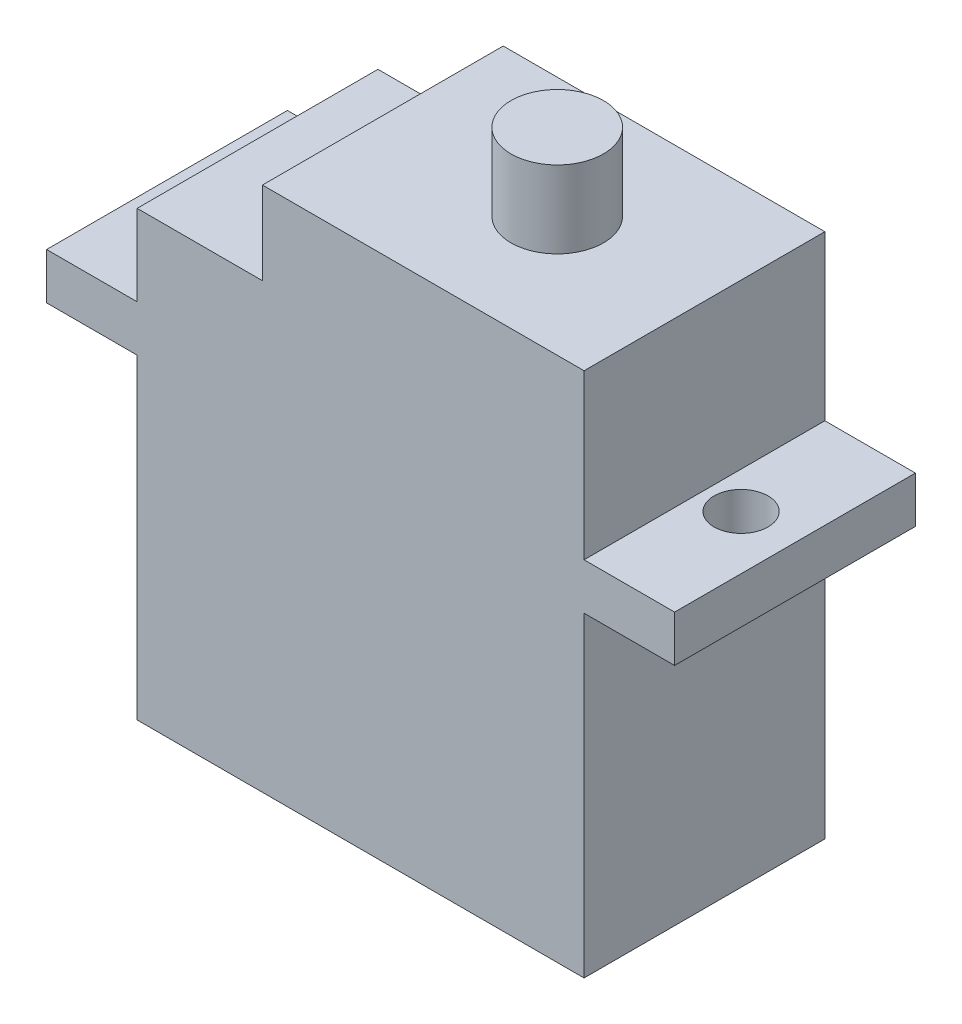
ISO-10303-21;
HEADER;
FILE_DESCRIPTION(('STEP AP214'),'2;1');
FILE_NAME('part.step','',(''),(''),'','','');
FILE_SCHEMA(('AUTOMOTIVE_DESIGN { 1 0 10303 214 1 1 1 1 }'));
ENDSEC;
DATA;
#1=APPLICATION_CONTEXT('core data for automotive mechanical design processes');
#2=APPLICATION_PROTOCOL_DEFINITION('international standard','automotive_design',2000,#1);
#3=PRODUCT_CONTEXT('',#1,'mechanical');
#4=PRODUCT('Part','Part','',(#3));
#5=PRODUCT_RELATED_PRODUCT_CATEGORY('part','',(#4));
#6=PRODUCT_DEFINITION_FORMATION('','',#4);
#7=PRODUCT_DEFINITION_CONTEXT('part definition',#1,'design');
#8=PRODUCT_DEFINITION('design','',#6,#7);
#9=PRODUCT_DEFINITION_SHAPE('','',#8);
#10=(LENGTH_UNIT() NAMED_UNIT(*) SI_UNIT(.MILLI.,.METRE.));
#11=(NAMED_UNIT(*) PLANE_ANGLE_UNIT() SI_UNIT($,.RADIAN.));
#12=(NAMED_UNIT(*) SI_UNIT($,.STERADIAN.) SOLID_ANGLE_UNIT());
#13=UNCERTAINTY_MEASURE_WITH_UNIT(LENGTH_MEASURE(1.E-05),#10,'distance_accuracy_value','');
#14=(GEOMETRIC_REPRESENTATION_CONTEXT(3) GLOBAL_UNCERTAINTY_ASSIGNED_CONTEXT((#13)) GLOBAL_UNIT_ASSIGNED_CONTEXT((#10,
#11,#12)) REPRESENTATION_CONTEXT('',''));
#15=CARTESIAN_POINT('',(0.,0.,0.));
#16=DIRECTION('',(0.,0.,1.));
#17=DIRECTION('',(1.,0.,0.));
#18=AXIS2_PLACEMENT_3D('',#15,#16,#17);
#19=CARTESIAN_POINT('',(0.,0.,12.5));
#20=DIRECTION('',(1.,0.,0.));
#21=DIRECTION('',(0.,1.,0.));
#22=AXIS2_PLACEMENT_3D('',#19,#20,#21);
#23=PLANE('',#22);
#24=DIRECTION('',(0.,-1.,0.));
#25=VECTOR('',#24,1.);
#26=CARTESIAN_POINT('',(0.,0.,0.));
#27=LINE('',#26,#25);
#28=CARTESIAN_POINT('',(0.,16.4,0.));
#29=VERTEX_POINT('',#28);
#30=CARTESIAN_POINT('',(0.,0.,0.));
#31=VERTEX_POINT('',#30);
#32=EDGE_CURVE('E185',#29,#31,#27,.T.);
#33=ORIENTED_EDGE('',*,*,#32,.T.);
#34=DIRECTION('',(0.,0.,-1.));
#35=VECTOR('',#34,1.);
#36=CARTESIAN_POINT('',(0.,0.,12.5));
#37=LINE('',#36,#35);
#38=CARTESIAN_POINT('',(0.,0.,12.5));
#39=VERTEX_POINT('',#38);
#40=EDGE_CURVE('E55',#39,#31,#37,.T.);
#41=ORIENTED_EDGE('',*,*,#40,.F.);
#42=DIRECTION('',(0.,-1.,0.));
#43=VECTOR('',#42,1.);
#44=CARTESIAN_POINT('',(0.,0.,12.5));
#45=LINE('',#44,#43);
#46=CARTESIAN_POINT('',(0.,16.4,12.5));
#47=VERTEX_POINT('',#46);
#48=EDGE_CURVE('E227',#47,#39,#45,.T.);
#49=ORIENTED_EDGE('',*,*,#48,.F.);
#50=DIRECTION('',(0.,0.,-1.));
#51=VECTOR('',#50,1.);
#52=CARTESIAN_POINT('',(0.,16.4,12.5));
#53=LINE('',#52,#51);
#54=EDGE_CURVE('E181',#47,#29,#53,.T.);
#55=ORIENTED_EDGE('',*,*,#54,.T.);
#56=EDGE_LOOP('',(#33,#41,#49,#55));
#57=FACE_BOUND('',#56,.T.);
#58=ADVANCED_FACE('F45',(#57),#23,.F.);
#59=CARTESIAN_POINT('',(0.,0.,12.5));
#60=DIRECTION('',(0.,1.,0.));
#61=DIRECTION('',(0.,0.,1.));
#62=AXIS2_PLACEMENT_3D('',#59,#60,#61);
#63=PLANE('',#62);
#64=DIRECTION('',(1.,0.,0.));
#65=VECTOR('',#64,1.);
#66=CARTESIAN_POINT('',(0.,0.,0.));
#67=LINE('',#66,#65);
#68=CARTESIAN_POINT('',(23.2,0.,0.));
#69=VERTEX_POINT('',#68);
#70=EDGE_CURVE('E189',#31,#69,#67,.T.);
#71=ORIENTED_EDGE('',*,*,#70,.T.);
#72=DIRECTION('',(0.,0.,-1.));
#73=VECTOR('',#72,1.);
#74=CARTESIAN_POINT('',(23.2,0.,12.5));
#75=LINE('',#74,#73);
#76=CARTESIAN_POINT('',(23.2,0.,12.5));
#77=VERTEX_POINT('',#76);
#78=EDGE_CURVE('E266',#77,#69,#75,.T.);
#79=ORIENTED_EDGE('',*,*,#78,.F.);
#80=DIRECTION('',(1.,0.,0.));
#81=VECTOR('',#80,1.);
#82=CARTESIAN_POINT('',(0.,0.,12.5));
#83=LINE('',#82,#81);
#84=EDGE_CURVE('E126',#39,#77,#83,.T.);
#85=ORIENTED_EDGE('',*,*,#84,.F.);
#86=ORIENTED_EDGE('',*,*,#40,.T.);
#87=EDGE_LOOP('',(#71,#79,#85,#86));
#88=FACE_BOUND('',#87,.T.);
#89=ADVANCED_FACE('F364',(#88),#63,.F.);
#90=CARTESIAN_POINT('',(23.2,0.,12.5));
#91=DIRECTION('',(-1.,0.,0.));
#92=DIRECTION('',(0.,0.,1.));
#93=AXIS2_PLACEMENT_3D('',#90,#91,#92);
#94=PLANE('',#93);
#95=DIRECTION('',(0.,1.,0.));
#96=VECTOR('',#95,1.);
#97=CARTESIAN_POINT('',(23.2,0.,0.));
#98=LINE('',#97,#96);
#99=CARTESIAN_POINT('',(23.2,16.4,0.));
#100=VERTEX_POINT('',#99);
#101=EDGE_CURVE('E193',#69,#100,#98,.T.);
#102=ORIENTED_EDGE('',*,*,#101,.T.);
#103=DIRECTION('',(0.,0.,-1.));
#104=VECTOR('',#103,1.);
#105=CARTESIAN_POINT('',(23.2,16.4,12.5));
#106=LINE('',#105,#104);
#107=CARTESIAN_POINT('',(23.2,16.4,12.5));
#108=VERTEX_POINT('',#107);
#109=EDGE_CURVE('E262',#108,#100,#106,.T.);
#110=ORIENTED_EDGE('',*,*,#109,.F.);
#111=DIRECTION('',(0.,1.,0.));
#112=VECTOR('',#111,1.);
#113=CARTESIAN_POINT('',(23.2,0.,12.5));
#114=LINE('',#113,#112);
#115=EDGE_CURVE('E294',#77,#108,#114,.T.);
#116=ORIENTED_EDGE('',*,*,#115,.F.);
#117=ORIENTED_EDGE('',*,*,#78,.T.);
#118=EDGE_LOOP('',(#102,#110,#116,#117));
#119=FACE_BOUND('',#118,.T.);
#120=ADVANCED_FACE('F337',(#119),#94,.F.);
#121=CARTESIAN_POINT('',(23.2,16.4,12.5));
#122=DIRECTION('',(0.,1.,0.));
#123=DIRECTION('',(0.,0.,1.));
#124=AXIS2_PLACEMENT_3D('',#121,#122,#123);
#125=PLANE('',#124);
#126=CARTESIAN_POINT('',(25.1,16.4,6.25));
#127=DIRECTION('',(0.,1.,0.));
#128=DIRECTION('',(0.,0.,1.));
#129=AXIS2_PLACEMENT_3D('',#126,#127,#128);
#130=CIRCLE('',#129,1.4);
#131=CARTESIAN_POINT('',(25.1,16.4,7.65));
#132=VERTEX_POINT('',#131);
#133=EDGE_CURVE('E190',#132,#132,#130,.T.);
#134=ORIENTED_EDGE('',*,*,#133,.T.);
#135=EDGE_LOOP('',(#134));
#136=FACE_BOUND('',#135,.T.);
#137=DIRECTION('',(1.,0.,0.));
#138=VECTOR('',#137,1.);
#139=CARTESIAN_POINT('',(23.2,16.4,0.));
#140=LINE('',#139,#138);
#141=CARTESIAN_POINT('',(27.9,16.4,0.));
#142=VERTEX_POINT('',#141);
#143=EDGE_CURVE('E196',#100,#142,#140,.T.);
#144=ORIENTED_EDGE('',*,*,#143,.T.);
#145=DIRECTION('',(0.,0.,-1.));
#146=VECTOR('',#145,1.);
#147=CARTESIAN_POINT('',(27.9,16.4,12.5));
#148=LINE('',#147,#146);
#149=CARTESIAN_POINT('',(27.9,16.4,12.5));
#150=VERTEX_POINT('',#149);
#151=EDGE_CURVE('E258',#150,#142,#148,.T.);
#152=ORIENTED_EDGE('',*,*,#151,.F.);
#153=DIRECTION('',(1.,0.,0.));
#154=VECTOR('',#153,1.);
#155=CARTESIAN_POINT('',(23.2,16.4,12.5));
#156=LINE('',#155,#154);
#157=EDGE_CURVE('E297',#108,#150,#156,.T.);
#158=ORIENTED_EDGE('',*,*,#157,.F.);
#159=ORIENTED_EDGE('',*,*,#109,.T.);
#160=EDGE_LOOP('',(#144,#152,#158,#159));
#161=FACE_BOUND('',#160,.T.);
#162=ADVANCED_FACE('F333',(#136,#161),#125,.F.);
#163=CARTESIAN_POINT('',(27.9,18.8,12.5));
#164=DIRECTION('',(-1.,0.,0.));
#165=DIRECTION('',(0.,0.,1.));
#166=AXIS2_PLACEMENT_3D('',#163,#164,#165);
#167=PLANE('',#166);
#168=DIRECTION('',(0.,1.,0.));
#169=VECTOR('',#168,1.);
#170=CARTESIAN_POINT('',(27.9,18.8,0.));
#171=LINE('',#170,#169);
#172=CARTESIAN_POINT('',(27.9,18.8,0.));
#173=VERTEX_POINT('',#172);
#174=EDGE_CURVE('E199',#142,#173,#171,.T.);
#175=ORIENTED_EDGE('',*,*,#174,.T.);
#176=DIRECTION('',(0.,0.,-1.));
#177=VECTOR('',#176,1.);
#178=CARTESIAN_POINT('',(27.9,18.8,12.5));
#179=LINE('',#178,#177);
#180=CARTESIAN_POINT('',(27.9,18.8,12.5));
#181=VERTEX_POINT('',#180);
#182=EDGE_CURVE('E254',#181,#173,#179,.T.);
#183=ORIENTED_EDGE('',*,*,#182,.F.);
#184=DIRECTION('',(0.,1.,0.));
#185=VECTOR('',#184,1.);
#186=CARTESIAN_POINT('',(27.9,18.8,12.5));
#187=LINE('',#186,#185);
#188=EDGE_CURVE('E300',#150,#181,#187,.T.);
#189=ORIENTED_EDGE('',*,*,#188,.F.);
#190=ORIENTED_EDGE('',*,*,#151,.T.);
#191=EDGE_LOOP('',(#175,#183,#189,#190));
#192=FACE_BOUND('',#191,.T.);
#193=ADVANCED_FACE('F336',(#192),#167,.F.);
#194=CARTESIAN_POINT('',(23.2,18.8,12.5));
#195=DIRECTION('',(0.,-1.,0.));
#196=DIRECTION('',(0.,0.,-1.));
#197=AXIS2_PLACEMENT_3D('',#194,#195,#196);
#198=PLANE('',#197);
#199=CARTESIAN_POINT('',(25.1,18.8,6.25));
#200=DIRECTION('',(0.,-1.,0.));
#201=DIRECTION('',(0.,0.,-1.));
#202=AXIS2_PLACEMENT_3D('',#199,#200,#201);
#203=CIRCLE('',#202,1.4);
#204=CARTESIAN_POINT('',(25.1,18.8,7.65));
#205=VERTEX_POINT('',#204);
#206=EDGE_CURVE('E48',#205,#205,#203,.T.);
#207=ORIENTED_EDGE('',*,*,#206,.T.);
#208=EDGE_LOOP('',(#207));
#209=FACE_BOUND('',#208,.T.);
#210=DIRECTION('',(-1.,0.,0.));
#211=VECTOR('',#210,1.);
#212=CARTESIAN_POINT('',(23.2,18.8,0.));
#213=LINE('',#212,#211);
#214=CARTESIAN_POINT('',(23.2,18.8,0.));
#215=VERTEX_POINT('',#214);
#216=EDGE_CURVE('E202',#173,#215,#213,.T.);
#217=ORIENTED_EDGE('',*,*,#216,.T.);
#218=DIRECTION('',(0.,0.,-1.));
#219=VECTOR('',#218,1.);
#220=CARTESIAN_POINT('',(23.2,18.8,12.5));
#221=LINE('',#220,#219);
#222=CARTESIAN_POINT('',(23.2,18.8,12.5));
#223=VERTEX_POINT('',#222);
#224=EDGE_CURVE('E250',#223,#215,#221,.T.);
#225=ORIENTED_EDGE('',*,*,#224,.F.);
#226=DIRECTION('',(-1.,0.,0.));
#227=VECTOR('',#226,1.);
#228=CARTESIAN_POINT('',(23.2,18.8,12.5));
#229=LINE('',#228,#227);
#230=EDGE_CURVE('E303',#181,#223,#229,.T.);
#231=ORIENTED_EDGE('',*,*,#230,.F.);
#232=ORIENTED_EDGE('',*,*,#182,.T.);
#233=EDGE_LOOP('',(#217,#225,#231,#232));
#234=FACE_BOUND('',#233,.T.);
#235=ADVANCED_FACE('F322',(#209,#234),#198,.F.);
#236=CARTESIAN_POINT('',(23.2,23.,12.5));
#237=DIRECTION('',(-1.,0.,0.));
#238=DIRECTION('',(0.,0.,1.));
#239=AXIS2_PLACEMENT_3D('',#236,#237,#238);
#240=PLANE('',#239);
#241=DIRECTION('',(0.,1.,0.));
#242=VECTOR('',#241,1.);
#243=CARTESIAN_POINT('',(23.2,23.,0.));
#244=LINE('',#243,#242);
#245=CARTESIAN_POINT('',(23.2,27.3,0.));
#246=VERTEX_POINT('',#245);
#247=EDGE_CURVE('E206',#215,#246,#244,.T.);
#248=ORIENTED_EDGE('',*,*,#247,.T.);
#249=DIRECTION('',(0.,0.,-1.));
#250=VECTOR('',#249,1.);
#251=CARTESIAN_POINT('',(23.2,27.3,12.5));
#252=LINE('',#251,#250);
#253=CARTESIAN_POINT('',(23.2,27.3,12.5));
#254=VERTEX_POINT('',#253);
#255=EDGE_CURVE('E246',#254,#246,#252,.T.);
#256=ORIENTED_EDGE('',*,*,#255,.F.);
#257=DIRECTION('',(0.,1.,0.));
#258=VECTOR('',#257,1.);
#259=CARTESIAN_POINT('',(23.2,18.8,12.5));
#260=LINE('',#259,#258);
#261=EDGE_CURVE('E306',#223,#254,#260,.T.);
#262=ORIENTED_EDGE('',*,*,#261,.F.);
#263=ORIENTED_EDGE('',*,*,#224,.T.);
#264=EDGE_LOOP('',(#248,#256,#262,#263));
#265=FACE_BOUND('',#264,.T.);
#266=ADVANCED_FACE('F357',(#265),#240,.F.);
#267=CARTESIAN_POINT('',(23.2,27.3,12.5));
#268=DIRECTION('',(0.,-1.,0.));
#269=DIRECTION('',(0.,0.,-1.));
#270=AXIS2_PLACEMENT_3D('',#267,#268,#269);
#271=PLANE('',#270);
#272=CARTESIAN_POINT('',(15.5569496470588,27.3,6.25));
#273=DIRECTION('',(0.,1.,0.));
#274=DIRECTION('',(0.,0.,1.));
#275=AXIS2_PLACEMENT_3D('',#272,#273,#274);
#276=CIRCLE('',#275,2.4);
#277=CARTESIAN_POINT('',(15.5569496470588,27.3,8.65));
#278=VERTEX_POINT('',#277);
#279=EDGE_CURVE('E11',#278,#278,#276,.T.);
#280=ORIENTED_EDGE('',*,*,#279,.F.);
#281=EDGE_LOOP('',(#280));
#282=FACE_BOUND('',#281,.T.);
#283=DIRECTION('',(-1.,0.,0.));
#284=VECTOR('',#283,1.);
#285=CARTESIAN_POINT('',(23.2,27.3,0.));
#286=LINE('',#285,#284);
#287=CARTESIAN_POINT('',(6.50402482495688,27.3,0.));
#288=VERTEX_POINT('',#287);
#289=EDGE_CURVE('E209',#246,#288,#286,.T.);
#290=ORIENTED_EDGE('',*,*,#289,.T.);
#291=DIRECTION('',(0.,0.,-1.));
#292=VECTOR('',#291,1.);
#293=CARTESIAN_POINT('',(6.50402482495688,27.3,12.5));
#294=LINE('',#293,#292);
#295=CARTESIAN_POINT('',(6.50402482495688,27.3,12.5));
#296=VERTEX_POINT('',#295);
#297=EDGE_CURVE('E242',#296,#288,#294,.T.);
#298=ORIENTED_EDGE('',*,*,#297,.F.);
#299=DIRECTION('',(-1.,0.,0.));
#300=VECTOR('',#299,1.);
#301=CARTESIAN_POINT('',(23.2,27.3,12.5));
#302=LINE('',#301,#300);
#303=EDGE_CURVE('E309',#254,#296,#302,.T.);
#304=ORIENTED_EDGE('',*,*,#303,.F.);
#305=ORIENTED_EDGE('',*,*,#255,.T.);
#306=EDGE_LOOP('',(#290,#298,#304,#305));
#307=FACE_BOUND('',#306,.T.);
#308=ADVANCED_FACE('F382',(#282,#307),#271,.F.);
#309=CARTESIAN_POINT('',(6.50402482495688,23.,12.5));
#310=DIRECTION('',(1.,0.,0.));
#311=DIRECTION('',(0.,0.,-1.));
#312=AXIS2_PLACEMENT_3D('',#309,#310,#311);
#313=PLANE('',#312);
#314=DIRECTION('',(0.,-1.,0.));
#315=VECTOR('',#314,1.);
#316=CARTESIAN_POINT('',(6.50402482495688,23.,0.));
#317=LINE('',#316,#315);
#318=CARTESIAN_POINT('',(6.50402482495688,23.,0.));
#319=VERTEX_POINT('',#318);
#320=EDGE_CURVE('E212',#288,#319,#317,.T.);
#321=ORIENTED_EDGE('',*,*,#320,.T.);
#322=DIRECTION('',(0.,0.,-1.));
#323=VECTOR('',#322,1.);
#324=CARTESIAN_POINT('',(6.50402482495688,23.,12.5));
#325=LINE('',#324,#323);
#326=CARTESIAN_POINT('',(6.50402482495688,23.,12.5));
#327=VERTEX_POINT('',#326);
#328=EDGE_CURVE('E238',#327,#319,#325,.T.);
#329=ORIENTED_EDGE('',*,*,#328,.F.);
#330=DIRECTION('',(0.,-1.,0.));
#331=VECTOR('',#330,1.);
#332=CARTESIAN_POINT('',(6.50402482495688,23.,12.5));
#333=LINE('',#332,#331);
#334=EDGE_CURVE('E312',#296,#327,#333,.T.);
#335=ORIENTED_EDGE('',*,*,#334,.F.);
#336=ORIENTED_EDGE('',*,*,#297,.T.);
#337=EDGE_LOOP('',(#321,#329,#335,#336));
#338=FACE_BOUND('',#337,.T.);
#339=ADVANCED_FACE('F380',(#338),#313,.F.);
#340=CARTESIAN_POINT('',(0.,23.,12.5));
#341=DIRECTION('',(0.,-1.,0.));
#342=DIRECTION('',(0.,0.,-1.));
#343=AXIS2_PLACEMENT_3D('',#340,#341,#342);
#344=PLANE('',#343);
#345=DIRECTION('',(-1.,0.,0.));
#346=VECTOR('',#345,1.);
#347=CARTESIAN_POINT('',(0.,23.,0.));
#348=LINE('',#347,#346);
#349=CARTESIAN_POINT('',(0.,23.,0.));
#350=VERTEX_POINT('',#349);
#351=EDGE_CURVE('E215',#319,#350,#348,.T.);
#352=ORIENTED_EDGE('',*,*,#351,.T.);
#353=DIRECTION('',(0.,0.,-1.));
#354=VECTOR('',#353,1.);
#355=CARTESIAN_POINT('',(0.,23.,12.5));
#356=LINE('',#355,#354);
#357=CARTESIAN_POINT('',(0.,23.,12.5));
#358=VERTEX_POINT('',#357);
#359=EDGE_CURVE('E234',#358,#350,#356,.T.);
#360=ORIENTED_EDGE('',*,*,#359,.F.);
#361=DIRECTION('',(-1.,0.,0.));
#362=VECTOR('',#361,1.);
#363=CARTESIAN_POINT('',(0.,23.,12.5));
#364=LINE('',#363,#362);
#365=EDGE_CURVE('E315',#327,#358,#364,.T.);
#366=ORIENTED_EDGE('',*,*,#365,.F.);
#367=ORIENTED_EDGE('',*,*,#328,.T.);
#368=EDGE_LOOP('',(#352,#360,#366,#367));
#369=FACE_BOUND('',#368,.T.);
#370=ADVANCED_FACE('F376',(#369),#344,.F.);
#371=CARTESIAN_POINT('',(0.,18.8,12.5));
#372=DIRECTION('',(1.,0.,0.));
#373=DIRECTION('',(0.,1.,0.));
#374=AXIS2_PLACEMENT_3D('',#371,#372,#373);
#375=PLANE('',#374);
#376=DIRECTION('',(0.,-1.,0.));
#377=VECTOR('',#376,1.);
#378=CARTESIAN_POINT('',(0.,18.8,0.));
#379=LINE('',#378,#377);
#380=CARTESIAN_POINT('',(0.,18.8,0.));
#381=VERTEX_POINT('',#380);
#382=EDGE_CURVE('E218',#350,#381,#379,.T.);
#383=ORIENTED_EDGE('',*,*,#382,.T.);
#384=DIRECTION('',(0.,0.,-1.));
#385=VECTOR('',#384,1.);
#386=CARTESIAN_POINT('',(0.,18.8,12.5));
#387=LINE('',#386,#385);
#388=CARTESIAN_POINT('',(0.,18.8,12.5));
#389=VERTEX_POINT('',#388);
#390=EDGE_CURVE('E174',#389,#381,#387,.T.);
#391=ORIENTED_EDGE('',*,*,#390,.F.);
#392=DIRECTION('',(0.,-1.,0.));
#393=VECTOR('',#392,1.);
#394=CARTESIAN_POINT('',(0.,18.8,12.5));
#395=LINE('',#394,#393);
#396=EDGE_CURVE('E163',#358,#389,#395,.T.);
#397=ORIENTED_EDGE('',*,*,#396,.F.);
#398=ORIENTED_EDGE('',*,*,#359,.T.);
#399=EDGE_LOOP('',(#383,#391,#397,#398));
#400=FACE_BOUND('',#399,.T.);
#401=ADVANCED_FACE('F372',(#400),#375,.F.);
#402=CARTESIAN_POINT('',(0.,18.8,12.5));
#403=DIRECTION('',(0.,-1.,0.));
#404=DIRECTION('',(0.,0.,-1.));
#405=AXIS2_PLACEMENT_3D('',#402,#403,#404);
#406=PLANE('',#405);
#407=CARTESIAN_POINT('',(-1.9,18.8,6.25));
#408=DIRECTION('',(0.,-1.,0.));
#409=DIRECTION('',(0.,0.,-1.));
#410=AXIS2_PLACEMENT_3D('',#407,#408,#409);
#411=CIRCLE('',#410,1.4);
#412=CARTESIAN_POINT('',(-1.9,18.8,4.85));
#413=VERTEX_POINT('',#412);
#414=EDGE_CURVE('E274',#413,#413,#411,.T.);
#415=ORIENTED_EDGE('',*,*,#414,.T.);
#416=EDGE_LOOP('',(#415));
#417=FACE_BOUND('',#416,.T.);
#418=DIRECTION('',(-1.,0.,0.));
#419=VECTOR('',#418,1.);
#420=CARTESIAN_POINT('',(0.,18.8,0.));
#421=LINE('',#420,#419);
#422=CARTESIAN_POINT('',(-4.7,18.8,0.));
#423=VERTEX_POINT('',#422);
#424=EDGE_CURVE('E172',#381,#423,#421,.T.);
#425=ORIENTED_EDGE('',*,*,#424,.T.);
#426=DIRECTION('',(0.,0.,-1.));
#427=VECTOR('',#426,1.);
#428=CARTESIAN_POINT('',(-4.7,18.8,12.5));
#429=LINE('',#428,#427);
#430=CARTESIAN_POINT('',(-4.7,18.8,12.5));
#431=VERTEX_POINT('',#430);
#432=EDGE_CURVE('E169',#431,#423,#429,.T.);
#433=ORIENTED_EDGE('',*,*,#432,.F.);
#434=DIRECTION('',(-1.,0.,0.));
#435=VECTOR('',#434,1.);
#436=CARTESIAN_POINT('',(0.,18.8,12.5));
#437=LINE('',#436,#435);
#438=EDGE_CURVE('E157',#389,#431,#437,.T.);
#439=ORIENTED_EDGE('',*,*,#438,.F.);
#440=ORIENTED_EDGE('',*,*,#390,.T.);
#441=EDGE_LOOP('',(#425,#433,#439,#440));
#442=FACE_BOUND('',#441,.T.);
#443=ADVANCED_FACE('F170',(#417,#442),#406,.F.);
#444=CARTESIAN_POINT('',(-4.7,18.8,12.5));
#445=DIRECTION('',(1.,0.,0.));
#446=DIRECTION('',(0.,0.,-1.));
#447=AXIS2_PLACEMENT_3D('',#444,#445,#446);
#448=PLANE('',#447);
#449=DIRECTION('',(0.,-1.,0.));
#450=VECTOR('',#449,1.);
#451=CARTESIAN_POINT('',(-4.7,18.8,0.));
#452=LINE('',#451,#450);
#453=CARTESIAN_POINT('',(-4.7,16.4,0.));
#454=VERTEX_POINT('',#453);
#455=EDGE_CURVE('E111',#423,#454,#452,.T.);
#456=ORIENTED_EDGE('',*,*,#455,.T.);
#457=DIRECTION('',(0.,0.,-1.));
#458=VECTOR('',#457,1.);
#459=CARTESIAN_POINT('',(-4.7,16.4,12.5));
#460=LINE('',#459,#458);
#461=CARTESIAN_POINT('',(-4.7,16.4,12.5));
#462=VERTEX_POINT('',#461);
#463=EDGE_CURVE('E175',#462,#454,#460,.T.);
#464=ORIENTED_EDGE('',*,*,#463,.F.);
#465=DIRECTION('',(0.,-1.,0.));
#466=VECTOR('',#465,1.);
#467=CARTESIAN_POINT('',(-4.7,18.8,12.5));
#468=LINE('',#467,#466);
#469=EDGE_CURVE('E161',#431,#462,#468,.T.);
#470=ORIENTED_EDGE('',*,*,#469,.F.);
#471=ORIENTED_EDGE('',*,*,#432,.T.);
#472=EDGE_LOOP('',(#456,#464,#470,#471));
#473=FACE_BOUND('',#472,.T.);
#474=ADVANCED_FACE('F177',(#473),#448,.F.);
#475=CARTESIAN_POINT('',(0.,16.4,12.5));
#476=DIRECTION('',(0.,1.,0.));
#477=DIRECTION('',(0.,0.,1.));
#478=AXIS2_PLACEMENT_3D('',#475,#476,#477);
#479=PLANE('',#478);
#480=CARTESIAN_POINT('',(-1.9,16.4,6.25));
#481=DIRECTION('',(0.,1.,0.));
#482=DIRECTION('',(0.,0.,1.));
#483=AXIS2_PLACEMENT_3D('',#480,#481,#482);
#484=CIRCLE('',#483,1.4);
#485=CARTESIAN_POINT('',(-1.9,16.4,7.65));
#486=VERTEX_POINT('',#485);
#487=EDGE_CURVE('E271',#486,#486,#484,.T.);
#488=ORIENTED_EDGE('',*,*,#487,.T.);
#489=EDGE_LOOP('',(#488));
#490=FACE_BOUND('',#489,.T.);
#491=DIRECTION('',(1.,0.,0.));
#492=VECTOR('',#491,1.);
#493=CARTESIAN_POINT('',(0.,16.4,0.));
#494=LINE('',#493,#492);
#495=EDGE_CURVE('E117',#454,#29,#494,.T.);
#496=ORIENTED_EDGE('',*,*,#495,.T.);
#497=ORIENTED_EDGE('',*,*,#54,.F.);
#498=DIRECTION('',(1.,0.,0.));
#499=VECTOR('',#498,1.);
#500=CARTESIAN_POINT('',(0.,16.4,12.5));
#501=LINE('',#500,#499);
#502=EDGE_CURVE('E64',#462,#47,#501,.T.);
#503=ORIENTED_EDGE('',*,*,#502,.F.);
#504=ORIENTED_EDGE('',*,*,#463,.T.);
#505=EDGE_LOOP('',(#496,#497,#503,#504));
#506=FACE_BOUND('',#505,.T.);
#507=ADVANCED_FACE('F367',(#490,#506),#479,.F.);
#508=CARTESIAN_POINT('',(0.,0.,12.5));
#509=DIRECTION('',(0.,0.,1.));
#510=DIRECTION('',(1.,0.,0.));
#511=AXIS2_PLACEMENT_3D('',#508,#509,#510);
#512=PLANE('',#511);
#513=ORIENTED_EDGE('',*,*,#48,.T.);
#514=ORIENTED_EDGE('',*,*,#84,.T.);
#515=ORIENTED_EDGE('',*,*,#115,.T.);
#516=ORIENTED_EDGE('',*,*,#157,.T.);
#517=ORIENTED_EDGE('',*,*,#188,.T.);
#518=ORIENTED_EDGE('',*,*,#230,.T.);
#519=ORIENTED_EDGE('',*,*,#261,.T.);
#520=ORIENTED_EDGE('',*,*,#303,.T.);
#521=ORIENTED_EDGE('',*,*,#334,.T.);
#522=ORIENTED_EDGE('',*,*,#365,.T.);
#523=ORIENTED_EDGE('',*,*,#396,.T.);
#524=ORIENTED_EDGE('',*,*,#438,.T.);
#525=ORIENTED_EDGE('',*,*,#469,.T.);
#526=ORIENTED_EDGE('',*,*,#502,.T.);
#527=EDGE_LOOP('',(#513,#514,#515,#516,#517,#518,#519,#520,#521,#522,#523,#524,#525,#526));
#528=FACE_BOUND('',#527,.T.);
#529=ADVANCED_FACE('F159',(#528),#512,.T.);
#530=CARTESIAN_POINT('',(0.,0.,0.));
#531=DIRECTION('',(0.,0.,1.));
#532=DIRECTION('',(1.,0.,0.));
#533=AXIS2_PLACEMENT_3D('',#530,#531,#532);
#534=PLANE('',#533);
#535=ORIENTED_EDGE('',*,*,#32,.F.);
#536=ORIENTED_EDGE('',*,*,#495,.F.);
#537=ORIENTED_EDGE('',*,*,#455,.F.);
#538=ORIENTED_EDGE('',*,*,#424,.F.);
#539=ORIENTED_EDGE('',*,*,#382,.F.);
#540=ORIENTED_EDGE('',*,*,#351,.F.);
#541=ORIENTED_EDGE('',*,*,#320,.F.);
#542=ORIENTED_EDGE('',*,*,#289,.F.);
#543=ORIENTED_EDGE('',*,*,#247,.F.);
#544=ORIENTED_EDGE('',*,*,#216,.F.);
#545=ORIENTED_EDGE('',*,*,#174,.F.);
#546=ORIENTED_EDGE('',*,*,#143,.F.);
#547=ORIENTED_EDGE('',*,*,#101,.F.);
#548=ORIENTED_EDGE('',*,*,#70,.F.);
#549=EDGE_LOOP('',(#535,#536,#537,#538,#539,#540,#541,#542,#543,#544,#545,#546,#547,#548));
#550=FACE_BOUND('',#549,.T.);
#551=ADVANCED_FACE('F351',(#550),#534,.F.);
#552=CARTESIAN_POINT('',(-1.9,14.8,6.25));
#553=DIRECTION('',(0.,1.,0.));
#554=DIRECTION('',(0.,0.,1.));
#555=AXIS2_PLACEMENT_3D('',#552,#553,#554);
#556=CYLINDRICAL_SURFACE('',#555,1.4);
#557=ORIENTED_EDGE('',*,*,#487,.F.);
#558=EDGE_LOOP('',(#557));
#559=FACE_BOUND('',#558,.T.);
#560=ORIENTED_EDGE('',*,*,#414,.F.);
#561=EDGE_LOOP('',(#560));
#562=FACE_BOUND('',#561,.T.);
#563=ADVANCED_FACE('F329',(#559,#562),#556,.F.);
#564=CARTESIAN_POINT('',(25.1,14.8,6.25));
#565=DIRECTION('',(0.,1.,0.));
#566=DIRECTION('',(0.,0.,1.));
#567=AXIS2_PLACEMENT_3D('',#564,#565,#566);
#568=CYLINDRICAL_SURFACE('',#567,1.4);
#569=CARTESIAN_POINT('',(25.1,18.8,7.65));
#570=CARTESIAN_POINT('',(25.1,18.775,7.65));
#571=CARTESIAN_POINT('',(25.1,18.75,7.65));
#572=CARTESIAN_POINT('',(25.1,18.7,7.65));
#573=CARTESIAN_POINT('',(25.1,18.675,7.65));
#574=CARTESIAN_POINT('',(25.1,18.625,7.65));
#575=CARTESIAN_POINT('',(25.1,18.6,7.65));
#576=CARTESIAN_POINT('',(25.1,18.55,7.65));
#577=CARTESIAN_POINT('',(25.1,18.525,7.65));
#578=CARTESIAN_POINT('',(25.1,18.475,7.65));
#579=CARTESIAN_POINT('',(25.1,18.45,7.65));
#580=CARTESIAN_POINT('',(25.1,18.4,7.65));
#581=CARTESIAN_POINT('',(25.1,18.375,7.65));
#582=CARTESIAN_POINT('',(25.1,18.325,7.65));
#583=CARTESIAN_POINT('',(25.1,18.3,7.65));
#584=CARTESIAN_POINT('',(25.1,18.25,7.65));
#585=CARTESIAN_POINT('',(25.1,18.225,7.65));
#586=CARTESIAN_POINT('',(25.1,18.175,7.65));
#587=CARTESIAN_POINT('',(25.1,18.15,7.65));
#588=CARTESIAN_POINT('',(25.1,18.1,7.65));
#589=CARTESIAN_POINT('',(25.1,18.075,7.65));
#590=CARTESIAN_POINT('',(25.1,18.025,7.65));
#591=CARTESIAN_POINT('',(25.1,18.,7.65));
#592=CARTESIAN_POINT('',(25.1,17.95,7.65));
#593=CARTESIAN_POINT('',(25.1,17.925,7.65));
#594=CARTESIAN_POINT('',(25.1,17.875,7.65));
#595=CARTESIAN_POINT('',(25.1,17.85,7.65));
#596=CARTESIAN_POINT('',(25.1,17.8,7.65));
#597=CARTESIAN_POINT('',(25.1,17.775,7.65));
#598=CARTESIAN_POINT('',(25.1,17.725,7.65));
#599=CARTESIAN_POINT('',(25.1,17.7,7.65));
#600=CARTESIAN_POINT('',(25.1,17.65,7.65));
#601=CARTESIAN_POINT('',(25.1,17.625,7.65));
#602=CARTESIAN_POINT('',(25.1,17.575,7.65));
#603=CARTESIAN_POINT('',(25.1,17.55,7.65));
#604=CARTESIAN_POINT('',(25.1,17.5,7.65));
#605=CARTESIAN_POINT('',(25.1,17.475,7.65));
#606=CARTESIAN_POINT('',(25.1,17.425,7.65));
#607=CARTESIAN_POINT('',(25.1,17.4,7.65));
#608=CARTESIAN_POINT('',(25.1,17.35,7.65));
#609=CARTESIAN_POINT('',(25.1,17.325,7.65));
#610=CARTESIAN_POINT('',(25.1,17.275,7.65));
#611=CARTESIAN_POINT('',(25.1,17.25,7.65));
#612=CARTESIAN_POINT('',(25.1,17.2,7.65));
#613=CARTESIAN_POINT('',(25.1,17.175,7.65));
#614=CARTESIAN_POINT('',(25.1,17.125,7.65));
#615=CARTESIAN_POINT('',(25.1,17.1,7.65));
#616=CARTESIAN_POINT('',(25.1,17.05,7.65));
#617=CARTESIAN_POINT('',(25.1,17.025,7.65));
#618=CARTESIAN_POINT('',(25.1,16.975,7.65));
#619=CARTESIAN_POINT('',(25.1,16.95,7.65));
#620=CARTESIAN_POINT('',(25.1,16.9,7.65));
#621=CARTESIAN_POINT('',(25.1,16.875,7.65));
#622=CARTESIAN_POINT('',(25.1,16.825,7.65));
#623=CARTESIAN_POINT('',(25.1,16.8,7.65));
#624=CARTESIAN_POINT('',(25.1,16.75,7.65));
#625=CARTESIAN_POINT('',(25.1,16.725,7.65));
#626=CARTESIAN_POINT('',(25.1,16.675,7.65));
#627=CARTESIAN_POINT('',(25.1,16.65,7.65));
#628=CARTESIAN_POINT('',(25.1,16.6,7.65));
#629=CARTESIAN_POINT('',(25.1,16.575,7.65));
#630=CARTESIAN_POINT('',(25.1,16.525,7.65));
#631=CARTESIAN_POINT('',(25.1,16.5,7.65));
#632=CARTESIAN_POINT('',(25.1,16.45,7.65));
#633=CARTESIAN_POINT('',(25.1,16.425,7.65));
#634=CARTESIAN_POINT('',(25.1,16.4,7.65));
#635=B_SPLINE_CURVE_WITH_KNOTS('',3,(#569,#570,#571,#572,#573,#574,#575,#576,#577,#578,#579,
#580,#581,#582,#583,#584,#585,#586,#587,#588,#589,#590,#591,#592,#593,#594,#595,#596,#597,#598,
#599,#600,#601,#602,#603,#604,#605,#606,#607,#608,#609,#610,#611,#612,#613,#614,#615,#616,#617,
#618,#619,#620,#621,#622,#623,#624,#625,#626,#627,#628,#629,#630,#631,#632,#633,#634),
.UNSPECIFIED.,.F.,.F.,(4,2,2,2,2,2,2,2,2,2,2,2,2,2,2,2,2,2,2,2,2,2,2,2,2,2,2,2,2,2,2,2,4),(0.,
0.0749999999999987,0.149999999999997,0.225,0.299999999999998,0.375,0.449999999999999,
0.524999999999998,0.6,0.674999999999998,0.750000000000001,0.824999999999999,0.899999999999998,
0.975,1.05,1.125,1.2,1.275,1.35,1.425,1.5,1.575,1.65,1.725,1.8,1.875,1.95,2.025,2.1,2.175,2.25,
2.325,2.4),.UNSPECIFIED.);
#636=EDGE_CURVE('BSEAM325',#205,#132,#635,.T.);
#637=ORIENTED_EDGE('',*,*,#206,.F.);
#638=ORIENTED_EDGE('',*,*,#133,.F.);
#639=ORIENTED_EDGE('',*,*,#636,.T.);
#640=ORIENTED_EDGE('',*,*,#636,.F.);
#641=EDGE_LOOP('',(#637,#639,#638,#640));
#642=FACE_BOUND('',#641,.T.);
#643=ADVANCED_FACE('F325',(#642),#568,.F.);
#644=CARTESIAN_POINT('',(15.5569496470588,31.3,6.25));
#645=DIRECTION('',(0.,-1.,0.));
#646=DIRECTION('',(0.,0.,-1.));
#647=AXIS2_PLACEMENT_3D('',#644,#645,#646);
#648=CYLINDRICAL_SURFACE('',#647,2.4);
#649=CARTESIAN_POINT('',(15.5569496470588,31.3,6.25));
#650=DIRECTION('',(0.,1.,0.));
#651=DIRECTION('',(0.,0.,1.));
#652=AXIS2_PLACEMENT_3D('',#649,#650,#651);
#653=CIRCLE('',#652,2.4);
#654=CARTESIAN_POINT('',(15.5569496470588,31.3,8.65));
#655=VERTEX_POINT('',#654);
#656=EDGE_CURVE('E275',#655,#655,#653,.T.);
#657=ORIENTED_EDGE('',*,*,#656,.F.);
#658=EDGE_LOOP('',(#657));
#659=FACE_BOUND('',#658,.T.);
#660=ORIENTED_EDGE('',*,*,#279,.T.);
#661=EDGE_LOOP('',(#660));
#662=FACE_BOUND('',#661,.T.);
#663=ADVANCED_FACE('F328',(#659,#662),#648,.T.);
#664=CARTESIAN_POINT('',(15.5569496470588,31.3,6.25));
#665=DIRECTION('',(0.,1.,0.));
#666=DIRECTION('',(0.,0.,1.));
#667=AXIS2_PLACEMENT_3D('',#664,#665,#666);
#668=PLANE('',#667);
#669=ORIENTED_EDGE('',*,*,#656,.T.);
#670=EDGE_LOOP('',(#669));
#671=FACE_BOUND('',#670,.T.);
#672=ADVANCED_FACE('F454',(#671),#668,.T.);
#673=CLOSED_SHELL('',(#58,#89,#120,#162,#193,#235,#266,#308,#339,#370,#401,#443,#474,#507,#529,
#551,#563,#643,#663,#672));
#674=MANIFOLD_SOLID_BREP('B2',#673);
#675=ADVANCED_BREP_SHAPE_REPRESENTATION('',(#18,#674),#14);
#676=SHAPE_DEFINITION_REPRESENTATION(#9,#675);
ENDSEC;
END-ISO-10303-21;
